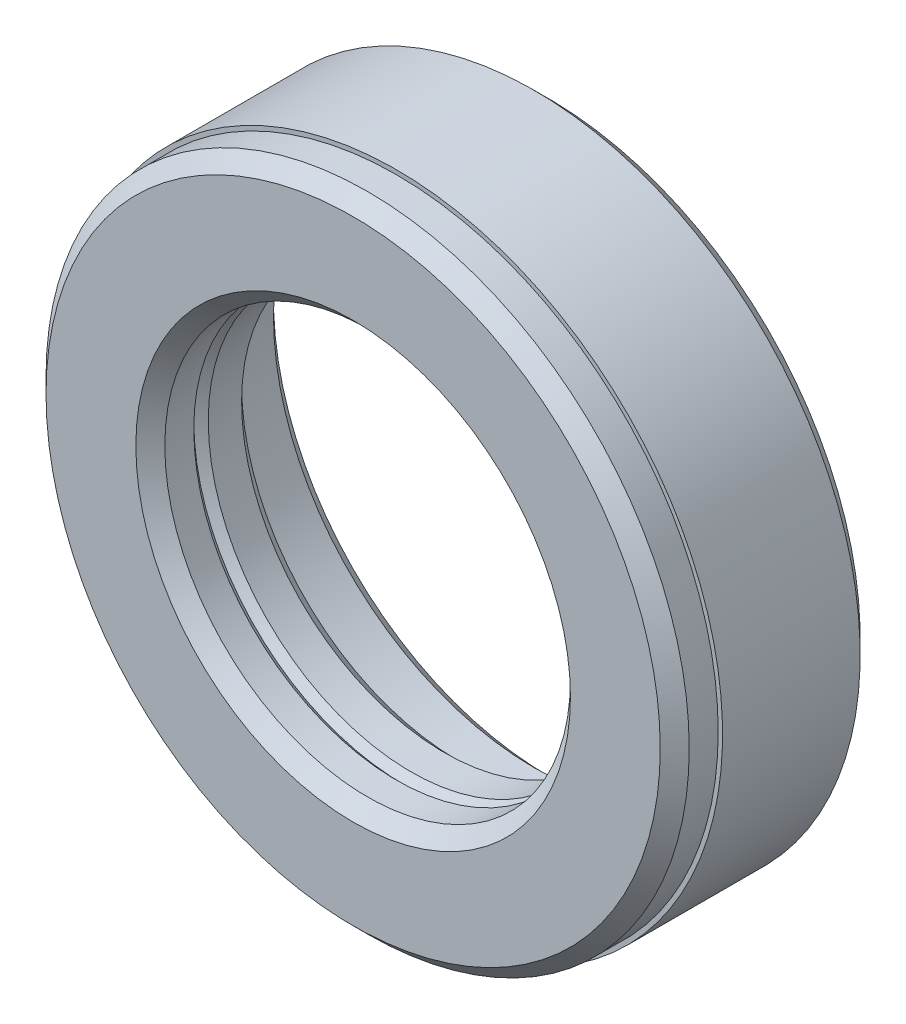
ISO-10303-21;
HEADER;
FILE_DESCRIPTION(('STEP AP214'),'2;1');
FILE_NAME('part.step','',(''),(''),'','','');
FILE_SCHEMA(('AUTOMOTIVE_DESIGN { 1 0 10303 214 1 1 1 1 }'));
ENDSEC;
DATA;
#1=APPLICATION_CONTEXT('core data for automotive mechanical design processes');
#2=APPLICATION_PROTOCOL_DEFINITION('international standard','automotive_design',2000,#1);
#3=PRODUCT_CONTEXT('',#1,'mechanical');
#4=PRODUCT('Part','Part','',(#3));
#5=PRODUCT_RELATED_PRODUCT_CATEGORY('part','',(#4));
#6=PRODUCT_DEFINITION_FORMATION('','',#4);
#7=PRODUCT_DEFINITION_CONTEXT('part definition',#1,'design');
#8=PRODUCT_DEFINITION('design','',#6,#7);
#9=PRODUCT_DEFINITION_SHAPE('','',#8);
#10=(LENGTH_UNIT() NAMED_UNIT(*) SI_UNIT(.MILLI.,.METRE.));
#11=(NAMED_UNIT(*) PLANE_ANGLE_UNIT() SI_UNIT($,.RADIAN.));
#12=(NAMED_UNIT(*) SI_UNIT($,.STERADIAN.) SOLID_ANGLE_UNIT());
#13=UNCERTAINTY_MEASURE_WITH_UNIT(LENGTH_MEASURE(1.E-05),#10,'distance_accuracy_value','');
#14=(GEOMETRIC_REPRESENTATION_CONTEXT(3) GLOBAL_UNCERTAINTY_ASSIGNED_CONTEXT((#13)) GLOBAL_UNIT_ASSIGNED_CONTEXT((#10,
#11,#12)) REPRESENTATION_CONTEXT('',''));
#15=CARTESIAN_POINT('',(0.,0.,0.));
#16=DIRECTION('',(0.,0.,1.));
#17=DIRECTION('',(1.,0.,0.));
#18=AXIS2_PLACEMENT_3D('',#15,#16,#17);
#19=CARTESIAN_POINT('',(0.,21.5,0.));
#20=DIRECTION('',(0.,0.,1.));
#21=DIRECTION('',(1.,0.,0.));
#22=AXIS2_PLACEMENT_3D('',#19,#20,#21);
#23=PLANE('',#22);
#24=CARTESIAN_POINT('',(0.,0.,0.));
#25=DIRECTION('',(0.,0.,1.));
#26=DIRECTION('',(1.,0.,0.));
#27=AXIS2_PLACEMENT_3D('',#24,#25,#26);
#28=CIRCLE('',#27,19.);
#29=CARTESIAN_POINT('',(19.,0.,0.));
#30=VERTEX_POINT('',#29);
#31=EDGE_CURVE('E50',#30,#30,#28,.T.);
#32=ORIENTED_EDGE('',*,*,#31,.T.);
#33=EDGE_LOOP('',(#32));
#34=FACE_BOUND('',#33,.T.);
#35=CARTESIAN_POINT('',(0.,0.,0.));
#36=DIRECTION('',(0.,0.,-1.));
#37=DIRECTION('',(-1.,0.,0.));
#38=AXIS2_PLACEMENT_3D('',#35,#36,#37);
#39=CIRCLE('',#38,21.5);
#40=CARTESIAN_POINT('',(-21.5,0.,0.));
#41=VERTEX_POINT('',#40);
#42=EDGE_CURVE('E59',#41,#41,#39,.T.);
#43=ORIENTED_EDGE('',*,*,#42,.T.);
#44=EDGE_LOOP('',(#43));
#45=FACE_BOUND('',#44,.T.);
#46=ADVANCED_FACE('F39',(#34,#45),#23,.F.);
#47=CARTESIAN_POINT('',(0.,0.,0.));
#48=DIRECTION('',(0.,0.,1.));
#49=DIRECTION('',(1.,0.,0.));
#50=AXIS2_PLACEMENT_3D('',#47,#48,#49);
#51=CONICAL_SURFACE('',#50,21.5,0.785398163397447);
#52=CARTESIAN_POINT('',(0.,0.,1.));
#53=DIRECTION('',(0.,0.,-1.));
#54=DIRECTION('',(-1.,0.,0.));
#55=AXIS2_PLACEMENT_3D('',#52,#53,#54);
#56=CIRCLE('',#55,22.5);
#57=CARTESIAN_POINT('',(-22.5,0.,1.));
#58=VERTEX_POINT('',#57);
#59=EDGE_CURVE('E62',#58,#58,#56,.T.);
#60=ORIENTED_EDGE('',*,*,#59,.T.);
#61=EDGE_LOOP('',(#60));
#62=FACE_BOUND('',#61,.T.);
#63=ORIENTED_EDGE('',*,*,#42,.F.);
#64=EDGE_LOOP('',(#63));
#65=FACE_BOUND('',#64,.T.);
#66=ADVANCED_FACE('F113',(#62,#65),#51,.T.);
#67=CARTESIAN_POINT('',(0.,0.,0.));
#68=DIRECTION('',(0.,0.,-1.));
#69=DIRECTION('',(-1.,0.,0.));
#70=AXIS2_PLACEMENT_3D('',#67,#68,#69);
#71=CYLINDRICAL_SURFACE('',#70,22.5);
#72=CARTESIAN_POINT('',(0.,0.,10.5));
#73=DIRECTION('',(0.,0.,-1.));
#74=DIRECTION('',(-1.,0.,0.));
#75=AXIS2_PLACEMENT_3D('',#72,#73,#74);
#76=CIRCLE('',#75,22.5);
#77=CARTESIAN_POINT('',(-22.5,0.,10.5));
#78=VERTEX_POINT('',#77);
#79=EDGE_CURVE('E65',#78,#78,#76,.T.);
#80=ORIENTED_EDGE('',*,*,#79,.T.);
#81=EDGE_LOOP('',(#80));
#82=FACE_BOUND('',#81,.T.);
#83=ORIENTED_EDGE('',*,*,#59,.F.);
#84=EDGE_LOOP('',(#83));
#85=FACE_BOUND('',#84,.T.);
#86=ADVANCED_FACE('F120',(#82,#85),#71,.T.);
#87=CARTESIAN_POINT('',(0.,22.5,10.5));
#88=DIRECTION('',(0.,0.,1.));
#89=DIRECTION('',(1.,0.,0.));
#90=AXIS2_PLACEMENT_3D('',#87,#88,#89);
#91=PLANE('',#90);
#92=CARTESIAN_POINT('',(0.,0.,10.5));
#93=DIRECTION('',(0.,0.,-1.));
#94=DIRECTION('',(-1.,0.,0.));
#95=AXIS2_PLACEMENT_3D('',#92,#93,#94);
#96=CIRCLE('',#95,22.2);
#97=CARTESIAN_POINT('',(-22.2,0.,10.5));
#98=VERTEX_POINT('',#97);
#99=EDGE_CURVE('E68',#98,#98,#96,.T.);
#100=ORIENTED_EDGE('',*,*,#99,.T.);
#101=EDGE_LOOP('',(#100));
#102=FACE_BOUND('',#101,.T.);
#103=ORIENTED_EDGE('',*,*,#79,.F.);
#104=EDGE_LOOP('',(#103));
#105=FACE_BOUND('',#104,.T.);
#106=ADVANCED_FACE('F127',(#102,#105),#91,.T.);
#107=CARTESIAN_POINT('',(0.,0.,0.));
#108=DIRECTION('',(0.,0.,-1.));
#109=DIRECTION('',(-1.,0.,0.));
#110=AXIS2_PLACEMENT_3D('',#107,#108,#109);
#111=CYLINDRICAL_SURFACE('',#110,22.2);
#112=CARTESIAN_POINT('',(0.,0.,12.5));
#113=DIRECTION('',(0.,0.,-1.));
#114=DIRECTION('',(-1.,0.,0.));
#115=AXIS2_PLACEMENT_3D('',#112,#113,#114);
#116=CIRCLE('',#115,22.2);
#117=CARTESIAN_POINT('',(-22.2,0.,12.5));
#118=VERTEX_POINT('',#117);
#119=EDGE_CURVE('E71',#118,#118,#116,.T.);
#120=ORIENTED_EDGE('',*,*,#119,.T.);
#121=EDGE_LOOP('',(#120));
#122=FACE_BOUND('',#121,.T.);
#123=ORIENTED_EDGE('',*,*,#99,.F.);
#124=EDGE_LOOP('',(#123));
#125=FACE_BOUND('',#124,.T.);
#126=ADVANCED_FACE('F131',(#122,#125),#111,.T.);
#127=CARTESIAN_POINT('',(0.,0.,12.5));
#128=DIRECTION('',(0.,0.,-1.));
#129=DIRECTION('',(-1.,0.,0.));
#130=AXIS2_PLACEMENT_3D('',#127,#128,#129);
#131=CONICAL_SURFACE('',#130,22.2,0.78539816339745);
#132=CARTESIAN_POINT('',(0.,0.,13.5));
#133=DIRECTION('',(0.,0.,-1.));
#134=DIRECTION('',(-1.,0.,0.));
#135=AXIS2_PLACEMENT_3D('',#132,#133,#134);
#136=CIRCLE('',#135,21.2);
#137=CARTESIAN_POINT('',(-21.2,0.,13.5));
#138=VERTEX_POINT('',#137);
#139=EDGE_CURVE('E74',#138,#138,#136,.T.);
#140=ORIENTED_EDGE('',*,*,#139,.T.);
#141=EDGE_LOOP('',(#140));
#142=FACE_BOUND('',#141,.T.);
#143=ORIENTED_EDGE('',*,*,#119,.F.);
#144=EDGE_LOOP('',(#143));
#145=FACE_BOUND('',#144,.T.);
#146=ADVANCED_FACE('F135',(#142,#145),#131,.T.);
#147=CARTESIAN_POINT('',(0.,21.2,13.5));
#148=DIRECTION('',(0.,0.,1.));
#149=DIRECTION('',(1.,0.,0.));
#150=AXIS2_PLACEMENT_3D('',#147,#148,#149);
#151=PLANE('',#150);
#152=CARTESIAN_POINT('',(0.,0.,13.5));
#153=DIRECTION('',(0.,0.,1.));
#154=DIRECTION('',(1.,0.,0.));
#155=AXIS2_PLACEMENT_3D('',#152,#153,#154);
#156=CIRCLE('',#155,15.);
#157=CARTESIAN_POINT('',(15.,0.,13.5));
#158=VERTEX_POINT('',#157);
#159=EDGE_CURVE('E46',#158,#158,#156,.F.);
#160=ORIENTED_EDGE('',*,*,#159,.T.);
#161=EDGE_LOOP('',(#160));
#162=FACE_BOUND('',#161,.T.);
#163=ORIENTED_EDGE('',*,*,#139,.F.);
#164=EDGE_LOOP('',(#163));
#165=FACE_BOUND('',#164,.T.);
#166=ADVANCED_FACE('F139',(#162,#165),#151,.T.);
#167=CARTESIAN_POINT('',(0.,0.,0.));
#168=DIRECTION('',(0.,0.,-1.));
#169=DIRECTION('',(-1.,0.,0.));
#170=AXIS2_PLACEMENT_3D('',#167,#168,#169);
#171=CYLINDRICAL_SURFACE('',#170,14.);
#172=CARTESIAN_POINT('',(0.,0.,12.5));
#173=DIRECTION('',(0.,0.,1.));
#174=DIRECTION('',(1.,0.,0.));
#175=AXIS2_PLACEMENT_3D('',#172,#173,#174);
#176=CIRCLE('',#175,14.);
#177=CARTESIAN_POINT('',(14.,0.,12.5));
#178=VERTEX_POINT('',#177);
#179=EDGE_CURVE('E10',#178,#178,#176,.T.);
#180=ORIENTED_EDGE('',*,*,#179,.T.);
#181=EDGE_LOOP('',(#180));
#182=FACE_BOUND('',#181,.T.);
#183=CARTESIAN_POINT('',(0.,0.,10.5));
#184=DIRECTION('',(0.,0.,-1.));
#185=DIRECTION('',(-1.,0.,0.));
#186=AXIS2_PLACEMENT_3D('',#183,#184,#185);
#187=CIRCLE('',#186,14.);
#188=CARTESIAN_POINT('',(-14.,0.,10.5));
#189=VERTEX_POINT('',#188);
#190=EDGE_CURVE('E77',#189,#189,#187,.T.);
#191=ORIENTED_EDGE('',*,*,#190,.T.);
#192=EDGE_LOOP('',(#191));
#193=FACE_BOUND('',#192,.T.);
#194=ADVANCED_FACE('F142',(#182,#193),#171,.F.);
#195=CARTESIAN_POINT('',(0.,0.,10.));
#196=DIRECTION('',(0.,0.,-1.));
#197=DIRECTION('',(-1.,0.,0.));
#198=AXIS2_PLACEMENT_3D('',#195,#196,#197);
#199=CONICAL_SURFACE('',#198,14.5,0.785398163397455);
#200=ORIENTED_EDGE('',*,*,#190,.F.);
#201=EDGE_LOOP('',(#200));
#202=FACE_BOUND('',#201,.T.);
#203=CARTESIAN_POINT('',(0.,0.,10.));
#204=DIRECTION('',(0.,0.,-1.));
#205=DIRECTION('',(-1.,0.,0.));
#206=AXIS2_PLACEMENT_3D('',#203,#204,#205);
#207=CIRCLE('',#206,14.5);
#208=CARTESIAN_POINT('',(-14.5,0.,10.));
#209=VERTEX_POINT('',#208);
#210=EDGE_CURVE('E80',#209,#209,#207,.T.);
#211=ORIENTED_EDGE('',*,*,#210,.T.);
#212=EDGE_LOOP('',(#211));
#213=FACE_BOUND('',#212,.T.);
#214=ADVANCED_FACE('F144',(#202,#213),#199,.F.);
#215=CARTESIAN_POINT('',(0.,0.,10.));
#216=DIRECTION('',(0.,0.,1.));
#217=DIRECTION('',(1.,0.,0.));
#218=AXIS2_PLACEMENT_3D('',#215,#216,#217);
#219=CONICAL_SURFACE('',#218,14.5,0.785398163397436);
#220=CARTESIAN_POINT('',(0.,0.,9.49999999999999));
#221=DIRECTION('',(0.,0.,-1.));
#222=DIRECTION('',(-1.,0.,0.));
#223=AXIS2_PLACEMENT_3D('',#220,#221,#222);
#224=CIRCLE('',#223,14.);
#225=CARTESIAN_POINT('',(-14.,0.,9.49999999999999));
#226=VERTEX_POINT('',#225);
#227=EDGE_CURVE('E83',#226,#226,#224,.T.);
#228=ORIENTED_EDGE('',*,*,#227,.T.);
#229=EDGE_LOOP('',(#228));
#230=FACE_BOUND('',#229,.T.);
#231=ORIENTED_EDGE('',*,*,#210,.F.);
#232=EDGE_LOOP('',(#231));
#233=FACE_BOUND('',#232,.T.);
#234=ADVANCED_FACE('F147',(#230,#233),#219,.F.);
#235=CARTESIAN_POINT('',(0.,0.,0.));
#236=DIRECTION('',(0.,0.,-1.));
#237=DIRECTION('',(-1.,0.,0.));
#238=AXIS2_PLACEMENT_3D('',#235,#236,#237);
#239=CYLINDRICAL_SURFACE('',#238,14.);
#240=ORIENTED_EDGE('',*,*,#227,.F.);
#241=EDGE_LOOP('',(#240));
#242=FACE_BOUND('',#241,.T.);
#243=CARTESIAN_POINT('',(0.,0.,7.2));
#244=DIRECTION('',(0.,0.,-1.));
#245=DIRECTION('',(-1.,0.,0.));
#246=AXIS2_PLACEMENT_3D('',#243,#244,#245);
#247=CIRCLE('',#246,14.);
#248=CARTESIAN_POINT('',(-14.,0.,7.2));
#249=VERTEX_POINT('',#248);
#250=EDGE_CURVE('E86',#249,#249,#247,.T.);
#251=ORIENTED_EDGE('',*,*,#250,.T.);
#252=EDGE_LOOP('',(#251));
#253=FACE_BOUND('',#252,.T.);
#254=ADVANCED_FACE('F151',(#242,#253),#239,.F.);
#255=CARTESIAN_POINT('',(0.,0.,6.2));
#256=DIRECTION('',(0.,0.,-1.));
#257=DIRECTION('',(-1.,0.,0.));
#258=AXIS2_PLACEMENT_3D('',#255,#256,#257);
#259=CONICAL_SURFACE('',#258,15.,0.78539816339745);
#260=ORIENTED_EDGE('',*,*,#250,.F.);
#261=EDGE_LOOP('',(#260));
#262=FACE_BOUND('',#261,.T.);
#263=CARTESIAN_POINT('',(0.,0.,6.2));
#264=DIRECTION('',(0.,0.,-1.));
#265=DIRECTION('',(-1.,0.,0.));
#266=AXIS2_PLACEMENT_3D('',#263,#264,#265);
#267=CIRCLE('',#266,15.);
#268=CARTESIAN_POINT('',(-15.,0.,6.2));
#269=VERTEX_POINT('',#268);
#270=EDGE_CURVE('E89',#269,#269,#267,.T.);
#271=ORIENTED_EDGE('',*,*,#270,.T.);
#272=EDGE_LOOP('',(#271));
#273=FACE_BOUND('',#272,.T.);
#274=ADVANCED_FACE('F109',(#262,#273),#259,.F.);
#275=CARTESIAN_POINT('',(0.,18.,6.2));
#276=DIRECTION('',(0.,0.,1.));
#277=DIRECTION('',(1.,0.,0.));
#278=AXIS2_PLACEMENT_3D('',#275,#276,#277);
#279=PLANE('',#278);
#280=ORIENTED_EDGE('',*,*,#270,.F.);
#281=EDGE_LOOP('',(#280));
#282=FACE_BOUND('',#281,.T.);
#283=CARTESIAN_POINT('',(0.,0.,6.2));
#284=DIRECTION('',(0.,0.,-1.));
#285=DIRECTION('',(-1.,0.,0.));
#286=AXIS2_PLACEMENT_3D('',#283,#284,#285);
#287=CIRCLE('',#286,18.);
#288=CARTESIAN_POINT('',(-18.,0.,6.2));
#289=VERTEX_POINT('',#288);
#290=EDGE_CURVE('E92',#289,#289,#287,.T.);
#291=ORIENTED_EDGE('',*,*,#290,.T.);
#292=EDGE_LOOP('',(#291));
#293=FACE_BOUND('',#292,.T.);
#294=ADVANCED_FACE('F96',(#282,#293),#279,.F.);
#295=CARTESIAN_POINT('',(0.,0.,0.));
#296=DIRECTION('',(0.,0.,-1.));
#297=DIRECTION('',(-1.,0.,0.));
#298=AXIS2_PLACEMENT_3D('',#295,#296,#297);
#299=CYLINDRICAL_SURFACE('',#298,18.);
#300=CARTESIAN_POINT('',(0.,0.,0.999999999999997));
#301=DIRECTION('',(0.,0.,1.));
#302=DIRECTION('',(1.,0.,0.));
#303=AXIS2_PLACEMENT_3D('',#300,#301,#302);
#304=CIRCLE('',#303,18.);
#305=CARTESIAN_POINT('',(18.,0.,0.999999999999997));
#306=VERTEX_POINT('',#305);
#307=EDGE_CURVE('E54',#306,#306,#304,.F.);
#308=ORIENTED_EDGE('',*,*,#307,.T.);
#309=EDGE_LOOP('',(#308));
#310=FACE_BOUND('',#309,.T.);
#311=ORIENTED_EDGE('',*,*,#290,.F.);
#312=EDGE_LOOP('',(#311));
#313=FACE_BOUND('',#312,.T.);
#314=ADVANCED_FACE('F98',(#310,#313),#299,.F.);
#315=CARTESIAN_POINT('',(0.,0.,0.999999999999997));
#316=DIRECTION('',(0.,0.,-1.));
#317=DIRECTION('',(-1.,0.,0.));
#318=AXIS2_PLACEMENT_3D('',#315,#316,#317);
#319=CONICAL_SURFACE('',#318,18.,0.785398163397448);
#320=ORIENTED_EDGE('',*,*,#31,.F.);
#321=EDGE_LOOP('',(#320));
#322=FACE_BOUND('',#321,.T.);
#323=ORIENTED_EDGE('',*,*,#307,.F.);
#324=EDGE_LOOP('',(#323));
#325=FACE_BOUND('',#324,.T.);
#326=ADVANCED_FACE('F100',(#322,#325),#319,.F.);
#327=CARTESIAN_POINT('',(0.,0.,13.5));
#328=DIRECTION('',(0.,0.,1.));
#329=DIRECTION('',(1.,0.,0.));
#330=AXIS2_PLACEMENT_3D('',#327,#328,#329);
#331=CONICAL_SURFACE('',#330,15.,0.785398163397445);
#332=ORIENTED_EDGE('',*,*,#179,.F.);
#333=EDGE_LOOP('',(#332));
#334=FACE_BOUND('',#333,.T.);
#335=ORIENTED_EDGE('',*,*,#159,.F.);
#336=EDGE_LOOP('',(#335));
#337=FACE_BOUND('',#336,.T.);
#338=ADVANCED_FACE('F41',(#334,#337),#331,.F.);
#339=CLOSED_SHELL('',(#46,#66,#86,#106,#126,#146,#166,#194,#214,#234,#254,#274,#294,#314,#326,#338));
#340=MANIFOLD_SOLID_BREP('B2',#339);
#341=ADVANCED_BREP_SHAPE_REPRESENTATION('',(#18,#340),#14);
#342=SHAPE_DEFINITION_REPRESENTATION(#9,#341);
ENDSEC;
END-ISO-10303-21;
